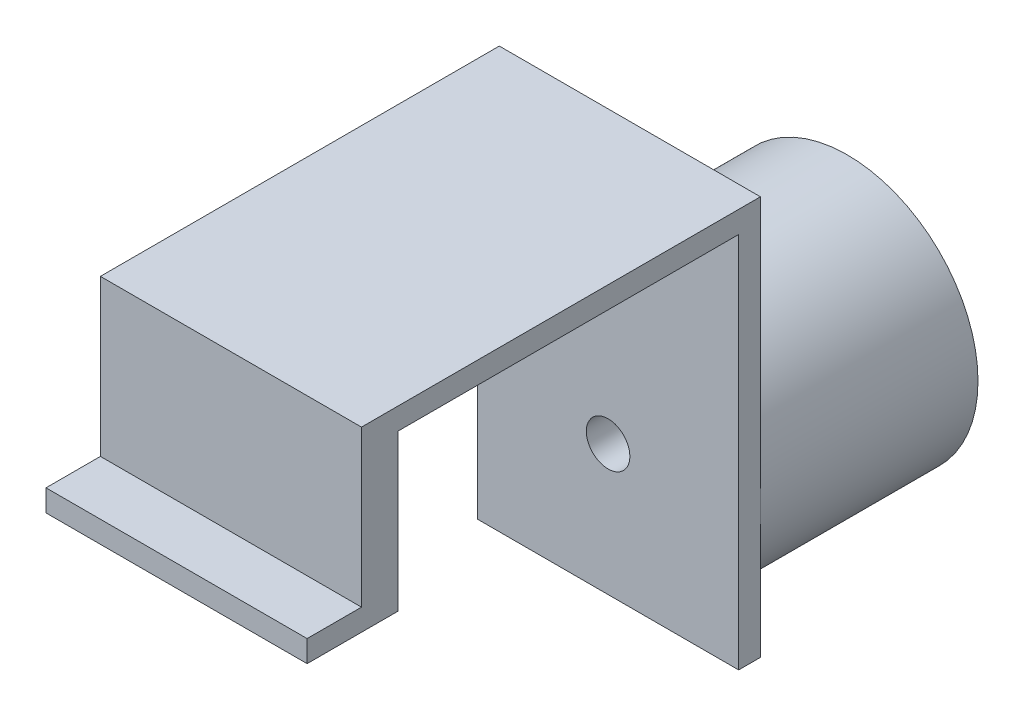
ISO-10303-21;
HEADER;
FILE_DESCRIPTION(('STEP AP214'),'2;1');
FILE_NAME('part.step','',(''),(''),'','','');
FILE_SCHEMA(('AUTOMOTIVE_DESIGN { 1 0 10303 214 1 1 1 1 }'));
ENDSEC;
DATA;
#1=APPLICATION_CONTEXT('core data for automotive mechanical design processes');
#2=APPLICATION_PROTOCOL_DEFINITION('international standard','automotive_design',2000,#1);
#3=PRODUCT_CONTEXT('',#1,'mechanical');
#4=PRODUCT('Part','Part','',(#3));
#5=PRODUCT_RELATED_PRODUCT_CATEGORY('part','',(#4));
#6=PRODUCT_DEFINITION_FORMATION('','',#4);
#7=PRODUCT_DEFINITION_CONTEXT('part definition',#1,'design');
#8=PRODUCT_DEFINITION('design','',#6,#7);
#9=PRODUCT_DEFINITION_SHAPE('','',#8);
#10=(LENGTH_UNIT() NAMED_UNIT(*) SI_UNIT(.MILLI.,.METRE.));
#11=(NAMED_UNIT(*) PLANE_ANGLE_UNIT() SI_UNIT($,.RADIAN.));
#12=(NAMED_UNIT(*) SI_UNIT($,.STERADIAN.) SOLID_ANGLE_UNIT());
#13=UNCERTAINTY_MEASURE_WITH_UNIT(LENGTH_MEASURE(1.E-05),#10,'distance_accuracy_value','');
#14=(GEOMETRIC_REPRESENTATION_CONTEXT(3) GLOBAL_UNCERTAINTY_ASSIGNED_CONTEXT((#13)) GLOBAL_UNIT_ASSIGNED_CONTEXT((#10,
#11,#12)) REPRESENTATION_CONTEXT('',''));
#15=CARTESIAN_POINT('',(0.,0.,0.));
#16=DIRECTION('',(0.,0.,1.));
#17=DIRECTION('',(1.,0.,0.));
#18=AXIS2_PLACEMENT_3D('',#15,#16,#17);
#19=CARTESIAN_POINT('',(0.,0.,85.));
#20=DIRECTION('',(0.,0.,-1.));
#21=DIRECTION('',(-1.,0.,0.));
#22=AXIS2_PLACEMENT_3D('',#19,#20,#21);
#23=PLANE('',#22);
#24=DIRECTION('',(-1.,0.,0.));
#25=VECTOR('',#24,1.);
#26=CARTESIAN_POINT('',(-18.,15.5,85.));
#27=LINE('',#26,#25);
#28=CARTESIAN_POINT('',(18.,15.5,85.));
#29=VERTEX_POINT('',#28);
#30=CARTESIAN_POINT('',(-18.,15.5,85.));
#31=VERTEX_POINT('',#30);
#32=EDGE_CURVE('E50',#29,#31,#27,.T.);
#33=ORIENTED_EDGE('',*,*,#32,.F.);
#34=DIRECTION('',(0.,1.,0.));
#35=VECTOR('',#34,1.);
#36=CARTESIAN_POINT('',(18.,34.,85.));
#37=LINE('',#36,#35);
#38=CARTESIAN_POINT('',(18.,37.,85.));
#39=VERTEX_POINT('',#38);
#40=EDGE_CURVE('E161',#29,#39,#37,.T.);
#41=ORIENTED_EDGE('',*,*,#40,.T.);
#42=DIRECTION('',(-1.,0.,0.));
#43=VECTOR('',#42,1.);
#44=CARTESIAN_POINT('',(-18.,37.,85.));
#45=LINE('',#44,#43);
#46=CARTESIAN_POINT('',(-18.,37.,85.));
#47=VERTEX_POINT('',#46);
#48=EDGE_CURVE('E133',#39,#47,#45,.T.);
#49=ORIENTED_EDGE('',*,*,#48,.T.);
#50=DIRECTION('',(0.,-1.,0.));
#51=VECTOR('',#50,1.);
#52=CARTESIAN_POINT('',(-18.,34.,85.));
#53=LINE('',#52,#51);
#54=EDGE_CURVE('E159',#47,#31,#53,.T.);
#55=ORIENTED_EDGE('',*,*,#54,.T.);
#56=EDGE_LOOP('',(#33,#41,#49,#55));
#57=FACE_BOUND('',#56,.T.);
#58=ADVANCED_FACE('F33',(#57),#23,.F.);
#59=CARTESIAN_POINT('',(0.,0.,33.));
#60=DIRECTION('',(0.,0.,1.));
#61=DIRECTION('',(1.,0.,0.));
#62=AXIS2_PLACEMENT_3D('',#59,#60,#61);
#63=PLANE('',#62);
#64=CARTESIAN_POINT('',(0.,0.,33.));
#65=DIRECTION('',(0.,0.,1.));
#66=DIRECTION('',(1.,0.,0.));
#67=AXIS2_PLACEMENT_3D('',#64,#65,#66);
#68=CIRCLE('',#67,3.);
#69=CARTESIAN_POINT('',(3.,0.,33.));
#70=VERTEX_POINT('',#69);
#71=EDGE_CURVE('E179',#70,#70,#68,.T.);
#72=ORIENTED_EDGE('',*,*,#71,.F.);
#73=EDGE_LOOP('',(#72));
#74=FACE_BOUND('',#73,.T.);
#75=DIRECTION('',(0.,1.,0.));
#76=VECTOR('',#75,1.);
#77=CARTESIAN_POINT('',(18.,37.,33.));
#78=LINE('',#77,#76);
#79=CARTESIAN_POINT('',(18.,-18.,33.));
#80=VERTEX_POINT('',#79);
#81=CARTESIAN_POINT('',(18.,34.,33.));
#82=VERTEX_POINT('',#81);
#83=EDGE_CURVE('E186',#80,#82,#78,.T.);
#84=ORIENTED_EDGE('',*,*,#83,.T.);
#85=DIRECTION('',(-1.,0.,0.));
#86=VECTOR('',#85,1.);
#87=CARTESIAN_POINT('',(18.,34.,33.));
#88=LINE('',#87,#86);
#89=CARTESIAN_POINT('',(-18.,34.,33.));
#90=VERTEX_POINT('',#89);
#91=EDGE_CURVE('E170',#82,#90,#88,.T.);
#92=ORIENTED_EDGE('',*,*,#91,.T.);
#93=DIRECTION('',(0.,-1.,0.));
#94=VECTOR('',#93,1.);
#95=CARTESIAN_POINT('',(-18.,37.,33.));
#96=LINE('',#95,#94);
#97=CARTESIAN_POINT('',(-18.,-18.,33.));
#98=VERTEX_POINT('',#97);
#99=EDGE_CURVE('E189',#90,#98,#96,.T.);
#100=ORIENTED_EDGE('',*,*,#99,.T.);
#101=DIRECTION('',(1.,0.,0.));
#102=VECTOR('',#101,1.);
#103=CARTESIAN_POINT('',(-18.,-18.,33.));
#104=LINE('',#103,#102);
#105=EDGE_CURVE('E192',#98,#80,#104,.T.);
#106=ORIENTED_EDGE('',*,*,#105,.T.);
#107=EDGE_LOOP('',(#84,#92,#100,#106));
#108=FACE_BOUND('',#107,.T.);
#109=ADVANCED_FACE('F249',(#74,#108),#63,.T.);
#110=CARTESIAN_POINT('',(0.,0.,30.));
#111=DIRECTION('',(0.,0.,-1.));
#112=DIRECTION('',(-1.,0.,0.));
#113=AXIS2_PLACEMENT_3D('',#110,#111,#112);
#114=CYLINDRICAL_SURFACE('',#113,18.);
#115=CARTESIAN_POINT('',(0.,0.,30.));
#116=DIRECTION('',(0.,0.,1.));
#117=DIRECTION('',(1.,0.,0.));
#118=AXIS2_PLACEMENT_3D('',#115,#116,#117);
#119=CIRCLE('',#118,18.);
#120=CARTESIAN_POINT('',(18.,0.,30.));
#121=VERTEX_POINT('',#120);
#122=CARTESIAN_POINT('',(-18.,0.,30.));
#123=VERTEX_POINT('',#122);
#124=EDGE_CURVE('E11',#121,#123,#119,.T.);
#125=ORIENTED_EDGE('',*,*,#124,.F.);
#126=CARTESIAN_POINT('',(0.,-18.,30.));
#127=VERTEX_POINT('',#126);
#128=EDGE_CURVE('E43',#127,#121,#119,.T.);
#129=ORIENTED_EDGE('',*,*,#128,.F.);
#130=EDGE_CURVE('E42',#123,#127,#119,.T.);
#131=ORIENTED_EDGE('',*,*,#130,.F.);
#132=EDGE_LOOP('',(#125,#129,#131));
#133=FACE_BOUND('',#132,.T.);
#134=CARTESIAN_POINT('',(0.,0.,0.));
#135=DIRECTION('',(0.,0.,1.));
#136=DIRECTION('',(1.,0.,0.));
#137=AXIS2_PLACEMENT_3D('',#134,#135,#136);
#138=CIRCLE('',#137,18.);
#139=CARTESIAN_POINT('',(18.,0.,0.));
#140=VERTEX_POINT('',#139);
#141=EDGE_CURVE('E37',#140,#140,#138,.T.);
#142=ORIENTED_EDGE('',*,*,#141,.T.);
#143=EDGE_LOOP('',(#142));
#144=FACE_BOUND('',#143,.T.);
#145=ADVANCED_FACE('F35',(#133,#144),#114,.T.);
#146=CARTESIAN_POINT('',(0.,0.,0.));
#147=DIRECTION('',(0.,0.,1.));
#148=DIRECTION('',(1.,0.,0.));
#149=AXIS2_PLACEMENT_3D('',#146,#147,#148);
#150=PLANE('',#149);
#151=CARTESIAN_POINT('',(0.,0.,0.));
#152=DIRECTION('',(0.,0.,1.));
#153=DIRECTION('',(1.,0.,0.));
#154=AXIS2_PLACEMENT_3D('',#151,#152,#153);
#155=CIRCLE('',#154,3.);
#156=CARTESIAN_POINT('',(3.,0.,0.));
#157=VERTEX_POINT('',#156);
#158=EDGE_CURVE('E182',#157,#157,#155,.F.);
#159=ORIENTED_EDGE('',*,*,#158,.F.);
#160=EDGE_LOOP('',(#159));
#161=FACE_BOUND('',#160,.T.);
#162=ORIENTED_EDGE('',*,*,#141,.F.);
#163=EDGE_LOOP('',(#162));
#164=FACE_BOUND('',#163,.T.);
#165=ADVANCED_FACE('F248',(#161,#164),#150,.F.);
#166=CARTESIAN_POINT('',(0.,0.,30.));
#167=DIRECTION('',(0.,0.,1.));
#168=DIRECTION('',(1.,0.,0.));
#169=AXIS2_PLACEMENT_3D('',#166,#167,#168);
#170=PLANE('',#169);
#171=DIRECTION('',(0.,1.,0.));
#172=VECTOR('',#171,1.);
#173=CARTESIAN_POINT('',(18.,37.,30.));
#174=LINE('',#173,#172);
#175=CARTESIAN_POINT('',(18.,37.,30.));
#176=VERTEX_POINT('',#175);
#177=EDGE_CURVE('E185',#121,#176,#174,.T.);
#178=ORIENTED_EDGE('',*,*,#177,.F.);
#179=ORIENTED_EDGE('',*,*,#124,.T.);
#180=DIRECTION('',(0.,-1.,0.));
#181=VECTOR('',#180,1.);
#182=CARTESIAN_POINT('',(-18.,37.,30.));
#183=LINE('',#182,#181);
#184=CARTESIAN_POINT('',(-18.,37.,30.));
#185=VERTEX_POINT('',#184);
#186=EDGE_CURVE('E200',#185,#123,#183,.T.);
#187=ORIENTED_EDGE('',*,*,#186,.F.);
#188=DIRECTION('',(-1.,0.,0.));
#189=VECTOR('',#188,1.);
#190=CARTESIAN_POINT('',(-18.,37.,30.));
#191=LINE('',#190,#189);
#192=EDGE_CURVE('E197',#176,#185,#191,.T.);
#193=ORIENTED_EDGE('',*,*,#192,.F.);
#194=EDGE_LOOP('',(#178,#179,#187,#193));
#195=FACE_BOUND('',#194,.T.);
#196=ADVANCED_FACE('F246',(#195),#170,.F.);
#197=CARTESIAN_POINT('',(-18.,-18.,30.));
#198=VERTEX_POINT('',#197);
#199=EDGE_CURVE('E199',#123,#198,#183,.T.);
#200=ORIENTED_EDGE('',*,*,#199,.F.);
#201=ORIENTED_EDGE('',*,*,#130,.T.);
#202=DIRECTION('',(1.,0.,0.));
#203=VECTOR('',#202,1.);
#204=CARTESIAN_POINT('',(-18.,-18.,30.));
#205=LINE('',#204,#203);
#206=EDGE_CURVE('E190',#198,#127,#205,.T.);
#207=ORIENTED_EDGE('',*,*,#206,.F.);
#208=EDGE_LOOP('',(#200,#201,#207));
#209=FACE_BOUND('',#208,.T.);
#210=ADVANCED_FACE('F231',(#209),#170,.F.);
#211=CARTESIAN_POINT('',(18.,-18.,30.));
#212=VERTEX_POINT('',#211);
#213=EDGE_CURVE('E203',#127,#212,#205,.T.);
#214=ORIENTED_EDGE('',*,*,#213,.F.);
#215=ORIENTED_EDGE('',*,*,#128,.T.);
#216=EDGE_CURVE('E195',#212,#121,#174,.T.);
#217=ORIENTED_EDGE('',*,*,#216,.F.);
#218=EDGE_LOOP('',(#214,#215,#217));
#219=FACE_BOUND('',#218,.T.);
#220=ADVANCED_FACE('F233',(#219),#170,.F.);
#221=CARTESIAN_POINT('',(18.,37.,33.));
#222=DIRECTION('',(-1.,0.,0.));
#223=DIRECTION('',(0.,-1.,0.));
#224=AXIS2_PLACEMENT_3D('',#221,#222,#223);
#225=PLANE('',#224);
#226=ORIENTED_EDGE('',*,*,#216,.T.);
#227=ORIENTED_EDGE('',*,*,#177,.T.);
#228=DIRECTION('',(0.,0.,-1.));
#229=VECTOR('',#228,1.);
#230=CARTESIAN_POINT('',(18.,37.,33.));
#231=LINE('',#230,#229);
#232=EDGE_CURVE('E214',#39,#176,#231,.T.);
#233=ORIENTED_EDGE('',*,*,#232,.F.);
#234=ORIENTED_EDGE('',*,*,#40,.F.);
#235=DIRECTION('',(0.,0.,-1.));
#236=VECTOR('',#235,1.);
#237=CARTESIAN_POINT('',(18.,15.5,92.5));
#238=LINE('',#237,#236);
#239=CARTESIAN_POINT('',(18.,15.5,92.5));
#240=VERTEX_POINT('',#239);
#241=EDGE_CURVE('E140',#240,#29,#238,.T.);
#242=ORIENTED_EDGE('',*,*,#241,.F.);
#243=DIRECTION('',(0.,1.,0.));
#244=VECTOR('',#243,1.);
#245=CARTESIAN_POINT('',(18.,15.5,92.5));
#246=LINE('',#245,#244);
#247=CARTESIAN_POINT('',(18.,12.5,92.5));
#248=VERTEX_POINT('',#247);
#249=EDGE_CURVE('E136',#248,#240,#246,.T.);
#250=ORIENTED_EDGE('',*,*,#249,.F.);
#251=DIRECTION('',(0.,0.,-1.));
#252=VECTOR('',#251,1.);
#253=CARTESIAN_POINT('',(18.,12.5,85.));
#254=LINE('',#253,#252);
#255=CARTESIAN_POINT('',(18.,12.5,80.));
#256=VERTEX_POINT('',#255);
#257=EDGE_CURVE('E122',#248,#256,#254,.T.);
#258=ORIENTED_EDGE('',*,*,#257,.T.);
#259=DIRECTION('',(0.,1.,0.));
#260=VECTOR('',#259,1.);
#261=CARTESIAN_POINT('',(18.,37.,80.));
#262=LINE('',#261,#260);
#263=CARTESIAN_POINT('',(18.,34.,80.));
#264=VERTEX_POINT('',#263);
#265=EDGE_CURVE('E162',#256,#264,#262,.T.);
#266=ORIENTED_EDGE('',*,*,#265,.T.);
#267=DIRECTION('',(0.,0.,-1.));
#268=VECTOR('',#267,1.);
#269=CARTESIAN_POINT('',(18.,34.,80.));
#270=LINE('',#269,#268);
#271=EDGE_CURVE('E176',#264,#82,#270,.T.);
#272=ORIENTED_EDGE('',*,*,#271,.T.);
#273=ORIENTED_EDGE('',*,*,#83,.F.);
#274=DIRECTION('',(0.,0.,-1.));
#275=VECTOR('',#274,1.);
#276=CARTESIAN_POINT('',(18.,-18.,33.));
#277=LINE('',#276,#275);
#278=EDGE_CURVE('E194',#80,#212,#277,.T.);
#279=ORIENTED_EDGE('',*,*,#278,.T.);
#280=EDGE_LOOP('',(#226,#227,#233,#234,#242,#250,#258,#266,#272,#273,#279));
#281=FACE_BOUND('',#280,.T.);
#282=ADVANCED_FACE('F138',(#281),#225,.F.);
#283=CARTESIAN_POINT('',(-18.,37.,33.));
#284=DIRECTION('',(0.,-1.,0.));
#285=DIRECTION('',(0.,0.,-1.));
#286=AXIS2_PLACEMENT_3D('',#283,#284,#285);
#287=PLANE('',#286);
#288=ORIENTED_EDGE('',*,*,#192,.T.);
#289=DIRECTION('',(0.,0.,-1.));
#290=VECTOR('',#289,1.);
#291=CARTESIAN_POINT('',(-18.,37.,33.));
#292=LINE('',#291,#290);
#293=EDGE_CURVE('E211',#47,#185,#292,.T.);
#294=ORIENTED_EDGE('',*,*,#293,.F.);
#295=ORIENTED_EDGE('',*,*,#48,.F.);
#296=ORIENTED_EDGE('',*,*,#232,.T.);
#297=EDGE_LOOP('',(#288,#294,#295,#296));
#298=FACE_BOUND('',#297,.T.);
#299=ADVANCED_FACE('F284',(#298),#287,.F.);
#300=CARTESIAN_POINT('',(-18.,37.,33.));
#301=DIRECTION('',(1.,0.,0.));
#302=DIRECTION('',(0.,1.,0.));
#303=AXIS2_PLACEMENT_3D('',#300,#301,#302);
#304=PLANE('',#303);
#305=ORIENTED_EDGE('',*,*,#186,.T.);
#306=ORIENTED_EDGE('',*,*,#199,.T.);
#307=DIRECTION('',(0.,0.,-1.));
#308=VECTOR('',#307,1.);
#309=CARTESIAN_POINT('',(-18.,-18.,33.));
#310=LINE('',#309,#308);
#311=EDGE_CURVE('E208',#98,#198,#310,.T.);
#312=ORIENTED_EDGE('',*,*,#311,.F.);
#313=ORIENTED_EDGE('',*,*,#99,.F.);
#314=DIRECTION('',(0.,0.,1.));
#315=VECTOR('',#314,1.);
#316=CARTESIAN_POINT('',(-18.,34.,33.));
#317=LINE('',#316,#315);
#318=CARTESIAN_POINT('',(-18.,34.,80.));
#319=VERTEX_POINT('',#318);
#320=EDGE_CURVE('E58',#90,#319,#317,.T.);
#321=ORIENTED_EDGE('',*,*,#320,.T.);
#322=DIRECTION('',(0.,-1.,0.));
#323=VECTOR('',#322,1.);
#324=CARTESIAN_POINT('',(-18.,12.5,80.));
#325=LINE('',#324,#323);
#326=CARTESIAN_POINT('',(-18.,12.5,80.));
#327=VERTEX_POINT('',#326);
#328=EDGE_CURVE('E158',#319,#327,#325,.T.);
#329=ORIENTED_EDGE('',*,*,#328,.T.);
#330=DIRECTION('',(0.,0.,-1.));
#331=VECTOR('',#330,1.);
#332=CARTESIAN_POINT('',(-18.,12.5,85.));
#333=LINE('',#332,#331);
#334=CARTESIAN_POINT('',(-18.,12.5,92.5));
#335=VERTEX_POINT('',#334);
#336=EDGE_CURVE('E132',#335,#327,#333,.T.);
#337=ORIENTED_EDGE('',*,*,#336,.F.);
#338=DIRECTION('',(0.,-1.,0.));
#339=VECTOR('',#338,1.);
#340=CARTESIAN_POINT('',(-18.,12.5,92.5));
#341=LINE('',#340,#339);
#342=CARTESIAN_POINT('',(-18.,15.5,92.5));
#343=VERTEX_POINT('',#342);
#344=EDGE_CURVE('E148',#343,#335,#341,.T.);
#345=ORIENTED_EDGE('',*,*,#344,.F.);
#346=DIRECTION('',(0.,0.,-1.));
#347=VECTOR('',#346,1.);
#348=CARTESIAN_POINT('',(-18.,15.5,92.5));
#349=LINE('',#348,#347);
#350=EDGE_CURVE('E153',#343,#31,#349,.T.);
#351=ORIENTED_EDGE('',*,*,#350,.T.);
#352=ORIENTED_EDGE('',*,*,#54,.F.);
#353=ORIENTED_EDGE('',*,*,#293,.T.);
#354=EDGE_LOOP('',(#305,#306,#312,#313,#321,#329,#337,#345,#351,#352,#353));
#355=FACE_BOUND('',#354,.T.);
#356=ADVANCED_FACE('F241',(#355),#304,.F.);
#357=CARTESIAN_POINT('',(-18.,-18.,33.));
#358=DIRECTION('',(0.,1.,0.));
#359=DIRECTION('',(0.,0.,1.));
#360=AXIS2_PLACEMENT_3D('',#357,#358,#359);
#361=PLANE('',#360);
#362=ORIENTED_EDGE('',*,*,#206,.T.);
#363=ORIENTED_EDGE('',*,*,#213,.T.);
#364=ORIENTED_EDGE('',*,*,#278,.F.);
#365=ORIENTED_EDGE('',*,*,#105,.F.);
#366=ORIENTED_EDGE('',*,*,#311,.T.);
#367=EDGE_LOOP('',(#362,#363,#364,#365,#366));
#368=FACE_BOUND('',#367,.T.);
#369=ADVANCED_FACE('F236',(#368),#361,.F.);
#370=CARTESIAN_POINT('',(0.,0.,33.));
#371=DIRECTION('',(0.,0.,-1.));
#372=DIRECTION('',(-1.,0.,0.));
#373=AXIS2_PLACEMENT_3D('',#370,#371,#372);
#374=CYLINDRICAL_SURFACE('',#373,3.);
#375=ORIENTED_EDGE('',*,*,#71,.T.);
#376=EDGE_LOOP('',(#375));
#377=FACE_BOUND('',#376,.T.);
#378=ORIENTED_EDGE('',*,*,#158,.T.);
#379=EDGE_LOOP('',(#378));
#380=FACE_BOUND('',#379,.T.);
#381=ADVANCED_FACE('F274',(#377,#380),#374,.F.);
#382=CARTESIAN_POINT('',(0.,34.,0.));
#383=DIRECTION('',(0.,1.,0.));
#384=DIRECTION('',(0.,0.,1.));
#385=AXIS2_PLACEMENT_3D('',#382,#383,#384);
#386=PLANE('',#385);
#387=ORIENTED_EDGE('',*,*,#91,.F.);
#388=ORIENTED_EDGE('',*,*,#271,.F.);
#389=DIRECTION('',(1.,0.,0.));
#390=VECTOR('',#389,1.);
#391=CARTESIAN_POINT('',(-18.,34.,80.));
#392=LINE('',#391,#390);
#393=EDGE_CURVE('E173',#319,#264,#392,.T.);
#394=ORIENTED_EDGE('',*,*,#393,.F.);
#395=ORIENTED_EDGE('',*,*,#320,.F.);
#396=EDGE_LOOP('',(#387,#388,#394,#395));
#397=FACE_BOUND('',#396,.T.);
#398=ADVANCED_FACE('F271',(#397),#386,.F.);
#399=CARTESIAN_POINT('',(18.,12.5,85.));
#400=DIRECTION('',(0.,1.,0.));
#401=DIRECTION('',(-1.,0.,0.));
#402=AXIS2_PLACEMENT_3D('',#399,#400,#401);
#403=PLANE('',#402);
#404=DIRECTION('',(1.,0.,0.));
#405=VECTOR('',#404,1.);
#406=CARTESIAN_POINT('',(18.,12.5,80.));
#407=LINE('',#406,#405);
#408=EDGE_CURVE('E129',#327,#256,#407,.T.);
#409=ORIENTED_EDGE('',*,*,#408,.T.);
#410=ORIENTED_EDGE('',*,*,#257,.F.);
#411=DIRECTION('',(1.,0.,0.));
#412=VECTOR('',#411,1.);
#413=CARTESIAN_POINT('',(18.,12.5,92.5));
#414=LINE('',#413,#412);
#415=EDGE_CURVE('E127',#335,#248,#414,.T.);
#416=ORIENTED_EDGE('',*,*,#415,.F.);
#417=ORIENTED_EDGE('',*,*,#336,.T.);
#418=EDGE_LOOP('',(#409,#410,#416,#417));
#419=FACE_BOUND('',#418,.T.);
#420=ADVANCED_FACE('F124',(#419),#403,.F.);
#421=CARTESIAN_POINT('',(0.,0.,80.));
#422=DIRECTION('',(0.,0.,-1.));
#423=DIRECTION('',(-1.,0.,0.));
#424=AXIS2_PLACEMENT_3D('',#421,#422,#423);
#425=PLANE('',#424);
#426=ORIENTED_EDGE('',*,*,#328,.F.);
#427=ORIENTED_EDGE('',*,*,#393,.T.);
#428=ORIENTED_EDGE('',*,*,#265,.F.);
#429=ORIENTED_EDGE('',*,*,#408,.F.);
#430=EDGE_LOOP('',(#426,#427,#428,#429));
#431=FACE_BOUND('',#430,.T.);
#432=ADVANCED_FACE('F265',(#431),#425,.T.);
#433=CARTESIAN_POINT('',(-18.,15.5,92.5));
#434=DIRECTION('',(0.,-1.,0.));
#435=DIRECTION('',(0.,0.,-1.));
#436=AXIS2_PLACEMENT_3D('',#433,#434,#435);
#437=PLANE('',#436);
#438=ORIENTED_EDGE('',*,*,#32,.T.);
#439=ORIENTED_EDGE('',*,*,#350,.F.);
#440=DIRECTION('',(-1.,0.,0.));
#441=VECTOR('',#440,1.);
#442=CARTESIAN_POINT('',(-18.,15.5,92.5));
#443=LINE('',#442,#441);
#444=EDGE_CURVE('E143',#240,#343,#443,.T.);
#445=ORIENTED_EDGE('',*,*,#444,.F.);
#446=ORIENTED_EDGE('',*,*,#241,.T.);
#447=EDGE_LOOP('',(#438,#439,#445,#446));
#448=FACE_BOUND('',#447,.T.);
#449=ADVANCED_FACE('F263',(#448),#437,.F.);
#450=CARTESIAN_POINT('',(0.,0.,92.5));
#451=DIRECTION('',(0.,0.,-1.));
#452=DIRECTION('',(-1.,0.,0.));
#453=AXIS2_PLACEMENT_3D('',#450,#451,#452);
#454=PLANE('',#453);
#455=ORIENTED_EDGE('',*,*,#415,.T.);
#456=ORIENTED_EDGE('',*,*,#249,.T.);
#457=ORIENTED_EDGE('',*,*,#444,.T.);
#458=ORIENTED_EDGE('',*,*,#344,.T.);
#459=EDGE_LOOP('',(#455,#456,#457,#458));
#460=FACE_BOUND('',#459,.T.);
#461=ADVANCED_FACE('F146',(#460),#454,.F.);
#462=CLOSED_SHELL('',(#58,#109,#145,#165,#196,#210,#220,#282,#299,#356,#369,#381,#398,#420,#432,
#449,#461));
#463=MANIFOLD_SOLID_BREP('B2',#462);
#464=ADVANCED_BREP_SHAPE_REPRESENTATION('',(#18,#463),#14);
#465=SHAPE_DEFINITION_REPRESENTATION(#9,#464);
ENDSEC;
END-ISO-10303-21;
